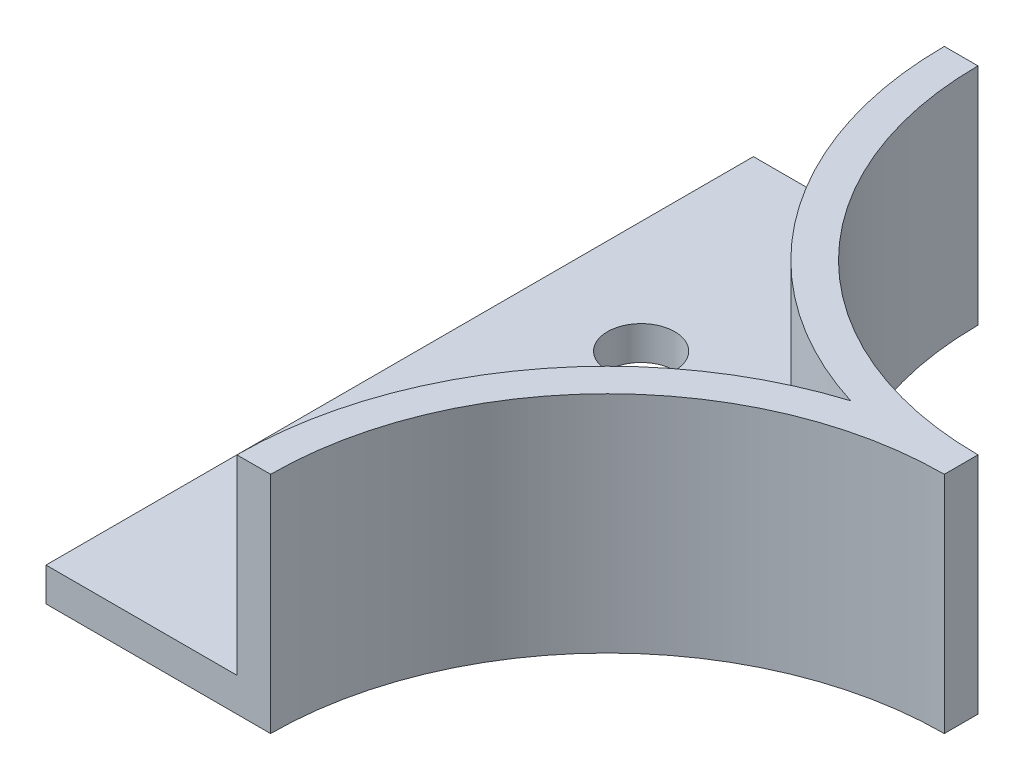
ISO-10303-21;
HEADER;
FILE_DESCRIPTION(('STEP AP214'),'2;1');
FILE_NAME('part.step','',(''),(''),'','','');
FILE_SCHEMA(('AUTOMOTIVE_DESIGN { 1 0 10303 214 1 1 1 1 }'));
ENDSEC;
DATA;
#1=APPLICATION_CONTEXT('core data for automotive mechanical design processes');
#2=APPLICATION_PROTOCOL_DEFINITION('international standard','automotive_design',2000,#1);
#3=PRODUCT_CONTEXT('',#1,'mechanical');
#4=PRODUCT('Part','Part','',(#3));
#5=PRODUCT_RELATED_PRODUCT_CATEGORY('part','',(#4));
#6=PRODUCT_DEFINITION_FORMATION('','',#4);
#7=PRODUCT_DEFINITION_CONTEXT('part definition',#1,'design');
#8=PRODUCT_DEFINITION('design','',#6,#7);
#9=PRODUCT_DEFINITION_SHAPE('','',#8);
#10=(LENGTH_UNIT() NAMED_UNIT(*) SI_UNIT(.MILLI.,.METRE.));
#11=(NAMED_UNIT(*) PLANE_ANGLE_UNIT() SI_UNIT($,.RADIAN.));
#12=(NAMED_UNIT(*) SI_UNIT($,.STERADIAN.) SOLID_ANGLE_UNIT());
#13=UNCERTAINTY_MEASURE_WITH_UNIT(LENGTH_MEASURE(1.E-05),#10,'distance_accuracy_value','');
#14=(GEOMETRIC_REPRESENTATION_CONTEXT(3) GLOBAL_UNCERTAINTY_ASSIGNED_CONTEXT((#13)) GLOBAL_UNIT_ASSIGNED_CONTEXT((#10,
#11,#12)) REPRESENTATION_CONTEXT('',''));
#15=CARTESIAN_POINT('',(0.,0.,0.));
#16=DIRECTION('',(0.,0.,1.));
#17=DIRECTION('',(1.,0.,0.));
#18=AXIS2_PLACEMENT_3D('',#15,#16,#17);
#19=CARTESIAN_POINT('',(0.,20.,0.));
#20=DIRECTION('',(1.,0.,0.));
#21=DIRECTION('',(0.,0.,-1.));
#22=AXIS2_PLACEMENT_3D('',#19,#20,#21);
#23=PLANE('',#22);
#24=DIRECTION('',(0.,-1.,0.));
#25=VECTOR('',#24,1.);
#26=CARTESIAN_POINT('',(0.,20.,31.5));
#27=LINE('',#26,#25);
#28=CARTESIAN_POINT('',(0.,3.,31.5));
#29=VERTEX_POINT('',#28);
#30=CARTESIAN_POINT('',(0.,0.,31.5));
#31=VERTEX_POINT('',#30);
#32=EDGE_CURVE('E145',#29,#31,#27,.T.);
#33=ORIENTED_EDGE('',*,*,#32,.F.);
#34=DIRECTION('',(0.,0.,1.));
#35=VECTOR('',#34,1.);
#36=CARTESIAN_POINT('',(0.,3.,-31.5));
#37=LINE('',#36,#35);
#38=CARTESIAN_POINT('',(0.,3.,-31.5));
#39=VERTEX_POINT('',#38);
#40=EDGE_CURVE('E50',#39,#29,#37,.T.);
#41=ORIENTED_EDGE('',*,*,#40,.F.);
#42=DIRECTION('',(0.,-1.,0.));
#43=VECTOR('',#42,1.);
#44=CARTESIAN_POINT('',(0.,20.,-31.5));
#45=LINE('',#44,#43);
#46=CARTESIAN_POINT('',(0.,0.,-31.5));
#47=VERTEX_POINT('',#46);
#48=EDGE_CURVE('E75',#39,#47,#45,.T.);
#49=ORIENTED_EDGE('',*,*,#48,.T.);
#50=DIRECTION('',(0.,0.,1.));
#51=VECTOR('',#50,1.);
#52=CARTESIAN_POINT('',(0.,0.,0.));
#53=LINE('',#52,#51);
#54=EDGE_CURVE('E80',#47,#31,#53,.T.);
#55=ORIENTED_EDGE('',*,*,#54,.T.);
#56=EDGE_LOOP('',(#33,#41,#49,#55));
#57=FACE_BOUND('',#56,.T.);
#58=ADVANCED_FACE('F36',(#57),#23,.F.);
#59=CARTESIAN_POINT('',(50.,20.,-31.5));
#60=DIRECTION('',(0.,1.,0.));
#61=DIRECTION('',(0.,0.,1.));
#62=AXIS2_PLACEMENT_3D('',#59,#60,#61);
#63=PLANE('',#62);
#64=CARTESIAN_POINT('',(50.,20.,-31.5));
#65=DIRECTION('',(0.,-1.,0.));
#66=DIRECTION('',(0.,0.,1.));
#67=AXIS2_PLACEMENT_3D('',#64,#65,#66);
#68=CIRCLE('',#67,33.);
#69=CARTESIAN_POINT('',(40.163842213547,20.,0.));
#70=VERTEX_POINT('',#69);
#71=CARTESIAN_POINT('',(17.,20.,-31.5));
#72=VERTEX_POINT('',#71);
#73=EDGE_CURVE('E152',#70,#72,#68,.T.);
#74=ORIENTED_EDGE('',*,*,#73,.F.);
#75=CARTESIAN_POINT('',(50.,20.,31.5));
#76=DIRECTION('',(0.,1.,0.));
#77=DIRECTION('',(0.,0.,-1.));
#78=AXIS2_PLACEMENT_3D('',#75,#76,#77);
#79=CIRCLE('',#78,33.);
#80=CARTESIAN_POINT('',(17.,20.,31.5));
#81=VERTEX_POINT('',#80);
#82=EDGE_CURVE('E190',#70,#81,#79,.T.);
#83=ORIENTED_EDGE('',*,*,#82,.T.);
#84=DIRECTION('',(-1.,0.,0.));
#85=VECTOR('',#84,1.);
#86=CARTESIAN_POINT('',(0.,20.,31.5));
#87=LINE('',#86,#85);
#88=CARTESIAN_POINT('',(20.,20.,31.5));
#89=VERTEX_POINT('',#88);
#90=EDGE_CURVE('E136',#89,#81,#87,.T.);
#91=ORIENTED_EDGE('',*,*,#90,.F.);
#92=CARTESIAN_POINT('',(50.,20.,31.5));
#93=DIRECTION('',(0.,1.,0.));
#94=DIRECTION('',(0.,0.,-1.));
#95=AXIS2_PLACEMENT_3D('',#92,#93,#94);
#96=CIRCLE('',#95,30.);
#97=CARTESIAN_POINT('',(50.,20.,1.5));
#98=VERTEX_POINT('',#97);
#99=EDGE_CURVE('E131',#98,#89,#96,.T.);
#100=ORIENTED_EDGE('',*,*,#99,.F.);
#101=DIRECTION('',(0.,0.,-1.));
#102=VECTOR('',#101,1.);
#103=CARTESIAN_POINT('',(50.,20.,-1.5));
#104=LINE('',#103,#102);
#105=CARTESIAN_POINT('',(50.,20.,-1.5));
#106=VERTEX_POINT('',#105);
#107=EDGE_CURVE('E93',#98,#106,#104,.T.);
#108=ORIENTED_EDGE('',*,*,#107,.T.);
#109=CARTESIAN_POINT('',(50.,20.,-31.5));
#110=DIRECTION('',(0.,-1.,0.));
#111=DIRECTION('',(0.,0.,1.));
#112=AXIS2_PLACEMENT_3D('',#109,#110,#111);
#113=CIRCLE('',#112,30.);
#114=CARTESIAN_POINT('',(20.,20.,-31.5));
#115=VERTEX_POINT('',#114);
#116=EDGE_CURVE('E59',#106,#115,#113,.T.);
#117=ORIENTED_EDGE('',*,*,#116,.T.);
#118=DIRECTION('',(-1.,0.,0.));
#119=VECTOR('',#118,1.);
#120=CARTESIAN_POINT('',(0.,20.,-31.5));
#121=LINE('',#120,#119);
#122=EDGE_CURVE('E84',#115,#72,#121,.T.);
#123=ORIENTED_EDGE('',*,*,#122,.T.);
#124=EDGE_LOOP('',(#74,#83,#91,#100,#108,#117,#123));
#125=FACE_BOUND('',#124,.T.);
#126=ADVANCED_FACE('F167',(#125),#63,.T.);
#127=CARTESIAN_POINT('',(0.,20.,31.5));
#128=DIRECTION('',(0.,0.,1.));
#129=DIRECTION('',(1.,0.,0.));
#130=AXIS2_PLACEMENT_3D('',#127,#128,#129);
#131=PLANE('',#130);
#132=ORIENTED_EDGE('',*,*,#90,.T.);
#133=DIRECTION('',(0.,1.,0.));
#134=VECTOR('',#133,1.);
#135=CARTESIAN_POINT('',(17.,3.,31.5));
#136=LINE('',#135,#134);
#137=CARTESIAN_POINT('',(17.,3.,31.5));
#138=VERTEX_POINT('',#137);
#139=EDGE_CURVE('E140',#138,#81,#136,.T.);
#140=ORIENTED_EDGE('',*,*,#139,.F.);
#141=DIRECTION('',(-1.,0.,0.));
#142=VECTOR('',#141,1.);
#143=CARTESIAN_POINT('',(0.,3.,31.5));
#144=LINE('',#143,#142);
#145=EDGE_CURVE('E182',#138,#29,#144,.T.);
#146=ORIENTED_EDGE('',*,*,#145,.T.);
#147=ORIENTED_EDGE('',*,*,#32,.T.);
#148=DIRECTION('',(-1.,0.,0.));
#149=VECTOR('',#148,1.);
#150=CARTESIAN_POINT('',(0.,0.,31.5));
#151=LINE('',#150,#149);
#152=CARTESIAN_POINT('',(20.,0.,31.5));
#153=VERTEX_POINT('',#152);
#154=EDGE_CURVE('E99',#153,#31,#151,.T.);
#155=ORIENTED_EDGE('',*,*,#154,.F.);
#156=DIRECTION('',(0.,-1.,0.));
#157=VECTOR('',#156,1.);
#158=CARTESIAN_POINT('',(20.,20.,31.5));
#159=LINE('',#158,#157);
#160=EDGE_CURVE('E130',#89,#153,#159,.T.);
#161=ORIENTED_EDGE('',*,*,#160,.F.);
#162=EDGE_LOOP('',(#132,#140,#146,#147,#155,#161));
#163=FACE_BOUND('',#162,.T.);
#164=ADVANCED_FACE('F203',(#163),#131,.T.);
#165=CARTESIAN_POINT('',(50.,20.,-1.5));
#166=DIRECTION('',(-1.,0.,0.));
#167=DIRECTION('',(0.,0.,1.));
#168=AXIS2_PLACEMENT_3D('',#165,#166,#167);
#169=PLANE('',#168);
#170=DIRECTION('',(0.,0.,-1.));
#171=VECTOR('',#170,1.);
#172=CARTESIAN_POINT('',(50.,0.,-1.5));
#173=LINE('',#172,#171);
#174=CARTESIAN_POINT('',(50.,0.,1.5));
#175=VERTEX_POINT('',#174);
#176=CARTESIAN_POINT('',(50.,0.,-1.5));
#177=VERTEX_POINT('',#176);
#178=EDGE_CURVE('E100',#175,#177,#173,.T.);
#179=ORIENTED_EDGE('',*,*,#178,.T.);
#180=DIRECTION('',(0.,-1.,0.));
#181=VECTOR('',#180,1.);
#182=CARTESIAN_POINT('',(50.,20.,-1.5));
#183=LINE('',#182,#181);
#184=EDGE_CURVE('E11',#106,#177,#183,.T.);
#185=ORIENTED_EDGE('',*,*,#184,.F.);
#186=ORIENTED_EDGE('',*,*,#107,.F.);
#187=DIRECTION('',(0.,-1.,0.));
#188=VECTOR('',#187,1.);
#189=CARTESIAN_POINT('',(50.,20.,1.5));
#190=LINE('',#189,#188);
#191=EDGE_CURVE('E124',#98,#175,#190,.T.);
#192=ORIENTED_EDGE('',*,*,#191,.T.);
#193=EDGE_LOOP('',(#179,#185,#186,#192));
#194=FACE_BOUND('',#193,.T.);
#195=ADVANCED_FACE('F125',(#194),#169,.F.);
#196=CARTESIAN_POINT('',(50.,20.,-31.5));
#197=DIRECTION('',(0.,-1.,0.));
#198=DIRECTION('',(0.,0.,-1.));
#199=AXIS2_PLACEMENT_3D('',#196,#197,#198);
#200=CYLINDRICAL_SURFACE('',#199,30.);
#201=CARTESIAN_POINT('',(50.,0.,-31.5));
#202=DIRECTION('',(0.,-1.,0.));
#203=DIRECTION('',(0.,0.,1.));
#204=AXIS2_PLACEMENT_3D('',#201,#202,#203);
#205=CIRCLE('',#204,30.);
#206=CARTESIAN_POINT('',(20.,0.,-31.5));
#207=VERTEX_POINT('',#206);
#208=EDGE_CURVE('E94',#177,#207,#205,.T.);
#209=ORIENTED_EDGE('',*,*,#208,.T.);
#210=DIRECTION('',(0.,-1.,0.));
#211=VECTOR('',#210,1.);
#212=CARTESIAN_POINT('',(20.,20.,-31.5));
#213=LINE('',#212,#211);
#214=EDGE_CURVE('E43',#115,#207,#213,.T.);
#215=ORIENTED_EDGE('',*,*,#214,.F.);
#216=ORIENTED_EDGE('',*,*,#116,.F.);
#217=ORIENTED_EDGE('',*,*,#184,.T.);
#218=EDGE_LOOP('',(#209,#215,#216,#217));
#219=FACE_BOUND('',#218,.T.);
#220=ADVANCED_FACE('F111',(#219),#200,.F.);
#221=CARTESIAN_POINT('',(0.,20.,-31.5));
#222=DIRECTION('',(0.,0.,1.));
#223=DIRECTION('',(1.,0.,0.));
#224=AXIS2_PLACEMENT_3D('',#221,#222,#223);
#225=PLANE('',#224);
#226=DIRECTION('',(-1.,0.,0.));
#227=VECTOR('',#226,1.);
#228=CARTESIAN_POINT('',(0.,3.,-31.5));
#229=LINE('',#228,#227);
#230=CARTESIAN_POINT('',(17.,3.,-31.5));
#231=VERTEX_POINT('',#230);
#232=EDGE_CURVE('E159',#231,#39,#229,.T.);
#233=ORIENTED_EDGE('',*,*,#232,.F.);
#234=DIRECTION('',(0.,1.,0.));
#235=VECTOR('',#234,1.);
#236=CARTESIAN_POINT('',(17.,3.,-31.5));
#237=LINE('',#236,#235);
#238=EDGE_CURVE('E101',#231,#72,#237,.T.);
#239=ORIENTED_EDGE('',*,*,#238,.T.);
#240=ORIENTED_EDGE('',*,*,#122,.F.);
#241=ORIENTED_EDGE('',*,*,#214,.T.);
#242=DIRECTION('',(-1.,0.,0.));
#243=VECTOR('',#242,1.);
#244=CARTESIAN_POINT('',(0.,0.,-31.5));
#245=LINE('',#244,#243);
#246=EDGE_CURVE('E88',#207,#47,#245,.T.);
#247=ORIENTED_EDGE('',*,*,#246,.T.);
#248=ORIENTED_EDGE('',*,*,#48,.F.);
#249=EDGE_LOOP('',(#233,#239,#240,#241,#247,#248));
#250=FACE_BOUND('',#249,.T.);
#251=ADVANCED_FACE('F89',(#250),#225,.F.);
#252=CARTESIAN_POINT('',(50.,0.,-31.5));
#253=DIRECTION('',(0.,1.,0.));
#254=DIRECTION('',(0.,0.,1.));
#255=AXIS2_PLACEMENT_3D('',#252,#253,#254);
#256=PLANE('',#255);
#257=CARTESIAN_POINT('',(10.,0.,11.5));
#258=DIRECTION('',(0.,-1.,0.));
#259=DIRECTION('',(0.,0.,-1.));
#260=AXIS2_PLACEMENT_3D('',#257,#258,#259);
#261=CIRCLE('',#260,3.);
#262=CARTESIAN_POINT('',(10.,0.,8.5));
#263=VERTEX_POINT('',#262);
#264=EDGE_CURVE('E194',#263,#263,#261,.T.);
#265=ORIENTED_EDGE('',*,*,#264,.F.);
#266=EDGE_LOOP('',(#265));
#267=FACE_BOUND('',#266,.T.);
#268=CARTESIAN_POINT('',(10.,0.,-11.5));
#269=DIRECTION('',(0.,1.,0.));
#270=DIRECTION('',(0.,0.,1.));
#271=AXIS2_PLACEMENT_3D('',#268,#269,#270);
#272=CIRCLE('',#271,3.);
#273=CARTESIAN_POINT('',(10.,0.,-8.5));
#274=VERTEX_POINT('',#273);
#275=EDGE_CURVE('E149',#274,#274,#272,.T.);
#276=ORIENTED_EDGE('',*,*,#275,.T.);
#277=EDGE_LOOP('',(#276));
#278=FACE_BOUND('',#277,.T.);
#279=ORIENTED_EDGE('',*,*,#54,.F.);
#280=ORIENTED_EDGE('',*,*,#246,.F.);
#281=ORIENTED_EDGE('',*,*,#208,.F.);
#282=ORIENTED_EDGE('',*,*,#178,.F.);
#283=CARTESIAN_POINT('',(50.,0.,31.5));
#284=DIRECTION('',(0.,1.,0.));
#285=DIRECTION('',(0.,0.,-1.));
#286=AXIS2_PLACEMENT_3D('',#283,#284,#285);
#287=CIRCLE('',#286,30.);
#288=EDGE_CURVE('E118',#175,#153,#287,.T.);
#289=ORIENTED_EDGE('',*,*,#288,.T.);
#290=ORIENTED_EDGE('',*,*,#154,.T.);
#291=EDGE_LOOP('',(#279,#280,#281,#282,#289,#290));
#292=FACE_BOUND('',#291,.T.);
#293=ADVANCED_FACE('F96',(#267,#278,#292),#256,.F.);
#294=CARTESIAN_POINT('',(50.,3.,-31.5));
#295=DIRECTION('',(0.,1.,0.));
#296=DIRECTION('',(0.,0.,1.));
#297=AXIS2_PLACEMENT_3D('',#294,#295,#296);
#298=CYLINDRICAL_SURFACE('',#297,33.);
#299=ORIENTED_EDGE('',*,*,#73,.T.);
#300=ORIENTED_EDGE('',*,*,#238,.F.);
#301=CARTESIAN_POINT('',(50.,3.,-31.5));
#302=DIRECTION('',(0.,-1.,0.));
#303=DIRECTION('',(0.,0.,1.));
#304=AXIS2_PLACEMENT_3D('',#301,#302,#303);
#305=CIRCLE('',#304,33.);
#306=CARTESIAN_POINT('',(40.163842213547,3.,0.));
#307=VERTEX_POINT('',#306);
#308=EDGE_CURVE('E156',#307,#231,#305,.T.);
#309=ORIENTED_EDGE('',*,*,#308,.F.);
#310=DIRECTION('',(0.,1.,0.));
#311=VECTOR('',#310,1.);
#312=CARTESIAN_POINT('',(40.163842213547,3.,0.));
#313=LINE('',#312,#311);
#314=EDGE_CURVE('E105',#307,#70,#313,.T.);
#315=ORIENTED_EDGE('',*,*,#314,.T.);
#316=EDGE_LOOP('',(#299,#300,#309,#315));
#317=FACE_BOUND('',#316,.T.);
#318=ADVANCED_FACE('F174',(#317),#298,.T.);
#319=CARTESIAN_POINT('',(50.,3.,-31.5));
#320=DIRECTION('',(0.,1.,0.));
#321=DIRECTION('',(0.,0.,1.));
#322=AXIS2_PLACEMENT_3D('',#319,#320,#321);
#323=PLANE('',#322);
#324=CARTESIAN_POINT('',(10.,3.,11.5));
#325=DIRECTION('',(0.,-1.,0.));
#326=DIRECTION('',(0.,0.,-1.));
#327=AXIS2_PLACEMENT_3D('',#324,#325,#326);
#328=CIRCLE('',#327,3.);
#329=CARTESIAN_POINT('',(10.,3.,8.5));
#330=VERTEX_POINT('',#329);
#331=EDGE_CURVE('E339',#330,#330,#328,.T.);
#332=ORIENTED_EDGE('',*,*,#331,.T.);
#333=EDGE_LOOP('',(#332));
#334=FACE_BOUND('',#333,.T.);
#335=CARTESIAN_POINT('',(10.,3.,-11.5));
#336=DIRECTION('',(0.,1.,0.));
#337=DIRECTION('',(0.,0.,1.));
#338=AXIS2_PLACEMENT_3D('',#335,#336,#337);
#339=CIRCLE('',#338,3.);
#340=CARTESIAN_POINT('',(10.,3.,-8.5));
#341=VERTEX_POINT('',#340);
#342=EDGE_CURVE('E148',#341,#341,#339,.T.);
#343=ORIENTED_EDGE('',*,*,#342,.F.);
#344=EDGE_LOOP('',(#343));
#345=FACE_BOUND('',#344,.T.);
#346=ORIENTED_EDGE('',*,*,#40,.T.);
#347=ORIENTED_EDGE('',*,*,#145,.F.);
#348=CARTESIAN_POINT('',(50.,3.,31.5));
#349=DIRECTION('',(0.,1.,0.));
#350=DIRECTION('',(0.,0.,-1.));
#351=AXIS2_PLACEMENT_3D('',#348,#349,#350);
#352=CIRCLE('',#351,33.);
#353=EDGE_CURVE('E180',#307,#138,#352,.T.);
#354=ORIENTED_EDGE('',*,*,#353,.F.);
#355=ORIENTED_EDGE('',*,*,#308,.T.);
#356=ORIENTED_EDGE('',*,*,#232,.T.);
#357=EDGE_LOOP('',(#346,#347,#354,#355,#356));
#358=FACE_BOUND('',#357,.T.);
#359=ADVANCED_FACE('F178',(#334,#345,#358),#323,.T.);
#360=CARTESIAN_POINT('',(10.,0.,-11.5));
#361=DIRECTION('',(0.,1.,0.));
#362=DIRECTION('',(0.,0.,1.));
#363=AXIS2_PLACEMENT_3D('',#360,#361,#362);
#364=CYLINDRICAL_SURFACE('',#363,3.);
#365=ORIENTED_EDGE('',*,*,#275,.F.);
#366=EDGE_LOOP('',(#365));
#367=FACE_BOUND('',#366,.T.);
#368=ORIENTED_EDGE('',*,*,#342,.T.);
#369=EDGE_LOOP('',(#368));
#370=FACE_BOUND('',#369,.T.);
#371=ADVANCED_FACE('F218',(#367,#370),#364,.F.);
#372=CARTESIAN_POINT('',(50.,20.,31.5));
#373=DIRECTION('',(0.,-1.,0.));
#374=DIRECTION('',(0.,0.,-1.));
#375=AXIS2_PLACEMENT_3D('',#372,#373,#374);
#376=CYLINDRICAL_SURFACE('',#375,30.);
#377=ORIENTED_EDGE('',*,*,#288,.F.);
#378=ORIENTED_EDGE('',*,*,#191,.F.);
#379=ORIENTED_EDGE('',*,*,#99,.T.);
#380=ORIENTED_EDGE('',*,*,#160,.T.);
#381=EDGE_LOOP('',(#377,#378,#379,#380));
#382=FACE_BOUND('',#381,.T.);
#383=ADVANCED_FACE('F134',(#382),#376,.F.);
#384=CARTESIAN_POINT('',(50.,3.,31.5));
#385=DIRECTION('',(0.,1.,0.));
#386=DIRECTION('',(0.,0.,1.));
#387=AXIS2_PLACEMENT_3D('',#384,#385,#386);
#388=CYLINDRICAL_SURFACE('',#387,33.);
#389=ORIENTED_EDGE('',*,*,#82,.F.);
#390=ORIENTED_EDGE('',*,*,#314,.F.);
#391=ORIENTED_EDGE('',*,*,#353,.T.);
#392=ORIENTED_EDGE('',*,*,#139,.T.);
#393=EDGE_LOOP('',(#389,#390,#391,#392));
#394=FACE_BOUND('',#393,.T.);
#395=ADVANCED_FACE('F207',(#394),#388,.T.);
#396=CARTESIAN_POINT('',(10.,0.,11.5));
#397=DIRECTION('',(0.,1.,0.));
#398=DIRECTION('',(0.,0.,1.));
#399=AXIS2_PLACEMENT_3D('',#396,#397,#398);
#400=CYLINDRICAL_SURFACE('',#399,3.);
#401=ORIENTED_EDGE('',*,*,#264,.T.);
#402=EDGE_LOOP('',(#401));
#403=FACE_BOUND('',#402,.T.);
#404=ORIENTED_EDGE('',*,*,#331,.F.);
#405=EDGE_LOOP('',(#404));
#406=FACE_BOUND('',#405,.T.);
#407=ADVANCED_FACE('F210',(#403,#406),#400,.F.);
#408=CLOSED_SHELL('',(#58,#126,#164,#195,#220,#251,#293,#318,#359,#371,#383,#395,#407));
#409=MANIFOLD_SOLID_BREP('B2',#408);
#410=ADVANCED_BREP_SHAPE_REPRESENTATION('',(#18,#409),#14);
#411=SHAPE_DEFINITION_REPRESENTATION(#9,#410);
ENDSEC;
END-ISO-10303-21;
